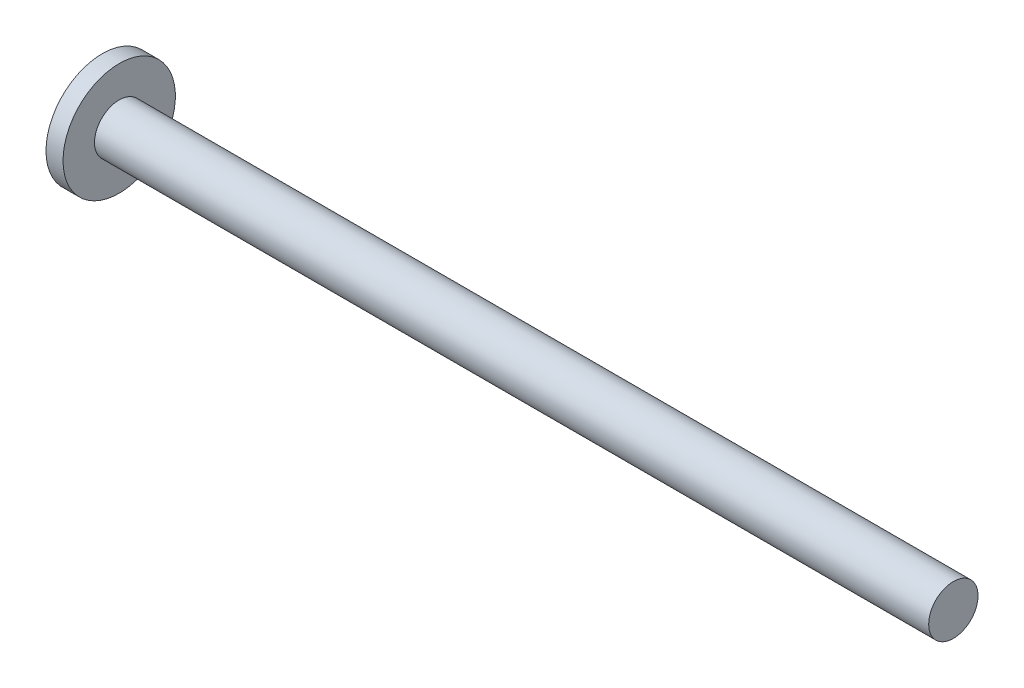
ISO-10303-21;
HEADER;
FILE_DESCRIPTION(('STEP AP214'),'2;1');
FILE_NAME('part.step','',(''),(''),'','','');
FILE_SCHEMA(('AUTOMOTIVE_DESIGN { 1 0 10303 214 1 1 1 1 }'));
ENDSEC;
DATA;
#1=APPLICATION_CONTEXT('core data for automotive mechanical design processes');
#2=APPLICATION_PROTOCOL_DEFINITION('international standard','automotive_design',2000,#1);
#3=PRODUCT_CONTEXT('',#1,'mechanical');
#4=PRODUCT('Part','Part','',(#3));
#5=PRODUCT_RELATED_PRODUCT_CATEGORY('part','',(#4));
#6=PRODUCT_DEFINITION_FORMATION('','',#4);
#7=PRODUCT_DEFINITION_CONTEXT('part definition',#1,'design');
#8=PRODUCT_DEFINITION('design','',#6,#7);
#9=PRODUCT_DEFINITION_SHAPE('','',#8);
#10=(LENGTH_UNIT() NAMED_UNIT(*) SI_UNIT(.MILLI.,.METRE.));
#11=(NAMED_UNIT(*) PLANE_ANGLE_UNIT() SI_UNIT($,.RADIAN.));
#12=(NAMED_UNIT(*) SI_UNIT($,.STERADIAN.) SOLID_ANGLE_UNIT());
#13=UNCERTAINTY_MEASURE_WITH_UNIT(LENGTH_MEASURE(1.E-05),#10,'distance_accuracy_value','');
#14=(GEOMETRIC_REPRESENTATION_CONTEXT(3) GLOBAL_UNCERTAINTY_ASSIGNED_CONTEXT((#13)) GLOBAL_UNIT_ASSIGNED_CONTEXT((#10,
#11,#12)) REPRESENTATION_CONTEXT('',''));
#15=CARTESIAN_POINT('',(0.,0.,0.));
#16=DIRECTION('',(0.,0.,1.));
#17=DIRECTION('',(1.,0.,0.));
#18=AXIS2_PLACEMENT_3D('',#15,#16,#17);
#19=CARTESIAN_POINT('',(-80.3637574418146,3.3528,0.));
#20=DIRECTION('',(1.,0.,0.));
#21=DIRECTION('',(0.,0.,-1.));
#22=AXIS2_PLACEMENT_3D('',#19,#20,#21);
#23=PLANE('',#22);
#24=CARTESIAN_POINT('',(-80.3637574418146,0.,0.));
#25=DIRECTION('',(-1.,0.,0.));
#26=DIRECTION('',(0.,0.,1.));
#27=AXIS2_PLACEMENT_3D('',#24,#25,#26);
#28=CIRCLE('',#27,3.3528);
#29=CARTESIAN_POINT('',(-80.3637574418146,0.,3.3528));
#30=VERTEX_POINT('',#29);
#31=EDGE_CURVE('E47',#30,#30,#28,.T.);
#32=ORIENTED_EDGE('',*,*,#31,.T.);
#33=EDGE_LOOP('',(#32));
#34=FACE_BOUND('',#33,.T.);
#35=ADVANCED_FACE('F33',(#34),#23,.F.);
#36=CARTESIAN_POINT('',(-29.5637574418147,0.,0.));
#37=DIRECTION('',(-1.,0.,0.));
#38=DIRECTION('',(0.,0.,1.));
#39=AXIS2_PLACEMENT_3D('',#36,#37,#38);
#40=PLANE('',#39);
#41=CARTESIAN_POINT('',(-29.5637574418147,0.,0.));
#42=DIRECTION('',(-1.,0.,0.));
#43=DIRECTION('',(0.,0.,1.));
#44=AXIS2_PLACEMENT_3D('',#41,#42,#43);
#45=CIRCLE('',#44,1.4732);
#46=CARTESIAN_POINT('',(-29.5637574418147,0.,1.4732));
#47=VERTEX_POINT('',#46);
#48=EDGE_CURVE('E10',#47,#47,#45,.T.);
#49=ORIENTED_EDGE('',*,*,#48,.F.);
#50=EDGE_LOOP('',(#49));
#51=FACE_BOUND('',#50,.T.);
#52=ADVANCED_FACE('F67',(#51),#40,.F.);
#53=CARTESIAN_POINT('',(-80.3637574418146,0.,0.));
#54=DIRECTION('',(-1.,0.,0.));
#55=DIRECTION('',(0.,0.,1.));
#56=AXIS2_PLACEMENT_3D('',#53,#54,#55);
#57=CYLINDRICAL_SURFACE('',#56,1.47319999999999);
#58=CARTESIAN_POINT('',(-79.3477574418146,0.,0.));
#59=DIRECTION('',(-1.,0.,0.));
#60=DIRECTION('',(0.,0.,1.));
#61=AXIS2_PLACEMENT_3D('',#58,#59,#60);
#62=CIRCLE('',#61,1.47319999999998);
#63=CARTESIAN_POINT('',(-79.3477574418146,0.,1.47319999999998));
#64=VERTEX_POINT('',#63);
#65=EDGE_CURVE('E39',#64,#64,#62,.T.);
#66=ORIENTED_EDGE('',*,*,#65,.F.);
#67=EDGE_LOOP('',(#66));
#68=FACE_BOUND('',#67,.T.);
#69=ORIENTED_EDGE('',*,*,#48,.T.);
#70=EDGE_LOOP('',(#69));
#71=FACE_BOUND('',#70,.T.);
#72=ADVANCED_FACE('F62',(#68,#71),#57,.T.);
#73=CARTESIAN_POINT('',(-79.3477574418146,1.47319999999998,0.));
#74=DIRECTION('',(-1.,0.,0.));
#75=DIRECTION('',(0.,0.,1.));
#76=AXIS2_PLACEMENT_3D('',#73,#74,#75);
#77=PLANE('',#76);
#78=CARTESIAN_POINT('',(-79.3477574418147,0.,0.));
#79=DIRECTION('',(-1.,0.,0.));
#80=DIRECTION('',(0.,0.,1.));
#81=AXIS2_PLACEMENT_3D('',#78,#79,#80);
#82=CIRCLE('',#81,3.3528);
#83=CARTESIAN_POINT('',(-79.3477574418147,0.,3.3528));
#84=VERTEX_POINT('',#83);
#85=EDGE_CURVE('E43',#84,#84,#82,.T.);
#86=ORIENTED_EDGE('',*,*,#85,.F.);
#87=EDGE_LOOP('',(#86));
#88=FACE_BOUND('',#87,.T.);
#89=ORIENTED_EDGE('',*,*,#65,.T.);
#90=EDGE_LOOP('',(#89));
#91=FACE_BOUND('',#90,.T.);
#92=ADVANCED_FACE('F57',(#88,#91),#77,.F.);
#93=CARTESIAN_POINT('',(-80.3637574418146,0.,0.));
#94=DIRECTION('',(-1.,0.,0.));
#95=DIRECTION('',(0.,0.,1.));
#96=AXIS2_PLACEMENT_3D('',#93,#94,#95);
#97=CYLINDRICAL_SURFACE('',#96,3.3528);
#98=ORIENTED_EDGE('',*,*,#31,.F.);
#99=EDGE_LOOP('',(#98));
#100=FACE_BOUND('',#99,.T.);
#101=ORIENTED_EDGE('',*,*,#85,.T.);
#102=EDGE_LOOP('',(#101));
#103=FACE_BOUND('',#102,.T.);
#104=ADVANCED_FACE('F54',(#100,#103),#97,.T.);
#105=CLOSED_SHELL('',(#35,#52,#72,#92,#104));
#106=MANIFOLD_SOLID_BREP('B2',#105);
#107=ADVANCED_BREP_SHAPE_REPRESENTATION('',(#18,#106),#14);
#108=SHAPE_DEFINITION_REPRESENTATION(#9,#107);
ENDSEC;
END-ISO-10303-21;
